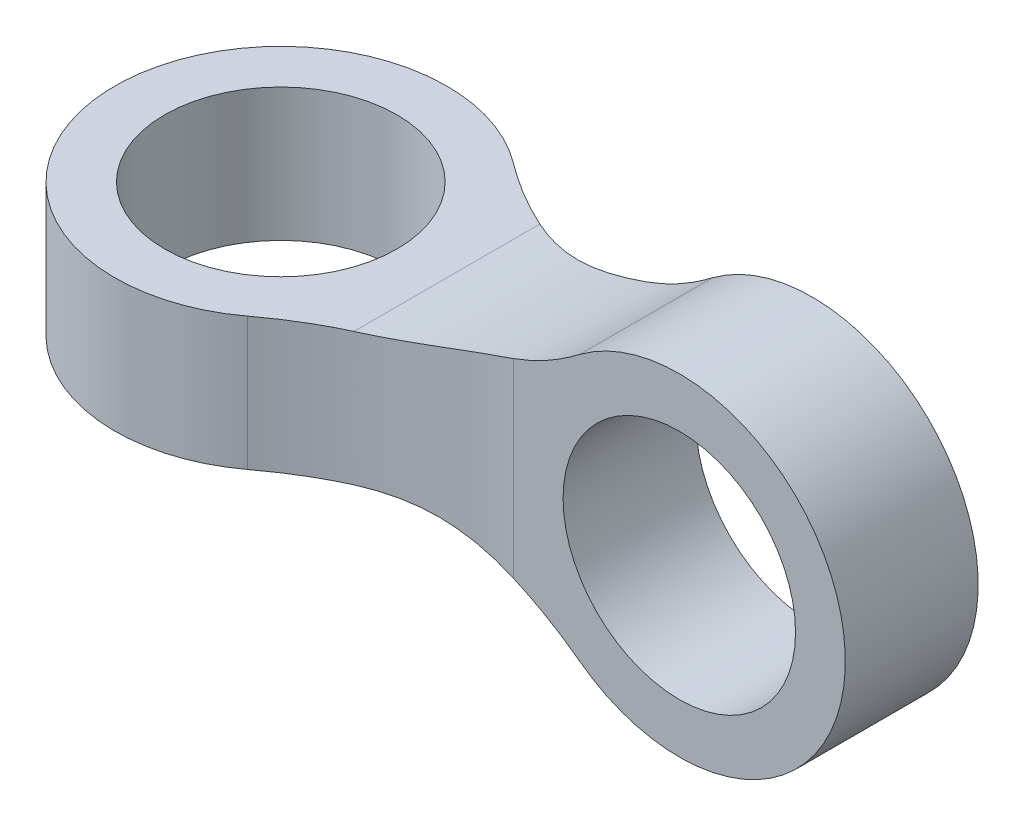
ISO-10303-21;
HEADER;
FILE_DESCRIPTION(('STEP AP214'),'2;1');
FILE_NAME('part.step','',(''),(''),'','','');
FILE_SCHEMA(('AUTOMOTIVE_DESIGN { 1 0 10303 214 1 1 1 1 }'));
ENDSEC;
DATA;
#1=APPLICATION_CONTEXT('core data for automotive mechanical design processes');
#2=APPLICATION_PROTOCOL_DEFINITION('international standard','automotive_design',2000,#1);
#3=PRODUCT_CONTEXT('',#1,'mechanical');
#4=PRODUCT('Part','Part','',(#3));
#5=PRODUCT_RELATED_PRODUCT_CATEGORY('part','',(#4));
#6=PRODUCT_DEFINITION_FORMATION('','',#4);
#7=PRODUCT_DEFINITION_CONTEXT('part definition',#1,'design');
#8=PRODUCT_DEFINITION('design','',#6,#7);
#9=PRODUCT_DEFINITION_SHAPE('','',#8);
#10=(LENGTH_UNIT() NAMED_UNIT(*) SI_UNIT(.MILLI.,.METRE.));
#11=(NAMED_UNIT(*) PLANE_ANGLE_UNIT() SI_UNIT($,.RADIAN.));
#12=(NAMED_UNIT(*) SI_UNIT($,.STERADIAN.) SOLID_ANGLE_UNIT());
#13=UNCERTAINTY_MEASURE_WITH_UNIT(LENGTH_MEASURE(1.E-05),#10,'distance_accuracy_value','');
#14=(GEOMETRIC_REPRESENTATION_CONTEXT(3) GLOBAL_UNCERTAINTY_ASSIGNED_CONTEXT((#13)) GLOBAL_UNIT_ASSIGNED_CONTEXT((#10,
#11,#12)) REPRESENTATION_CONTEXT('',''));
#15=CARTESIAN_POINT('',(0.,0.,0.));
#16=DIRECTION('',(0.,0.,1.));
#17=DIRECTION('',(1.,0.,0.));
#18=AXIS2_PLACEMENT_3D('',#15,#16,#17);
#19=CARTESIAN_POINT('',(90.,60.,-20.));
#20=CARTESIAN_POINT('',(73.7408291214227,60.,-19.9572997651025));
#21=CARTESIAN_POINT('',(53.5221056387912,60.,-22.3584207709066));
#22=CARTESIAN_POINT('',(30.,60.,-40.));
#23=B_SPLINE_CURVE_WITH_KNOTS('',3,(#19,#20,#21,#22),.UNSPECIFIED.,.F.,.F.,(4,4),(0.,0.5),.UNSPECIFIED.);
#24=DIRECTION('',(0.,-1.,0.));
#25=VECTOR('',#24,1.);
#26=SURFACE_OF_LINEAR_EXTRUSION('',#23,#25);
#27=CARTESIAN_POINT('',(90.,28.9330573132932,-20.));
#28=CARTESIAN_POINT('',(89.4810429815222,28.7428918932531,-19.9986251547515));
#29=CARTESIAN_POINT('',(88.9605668632478,28.5569066879373,-19.9997698882981));
#30=CARTESIAN_POINT('',(87.9172321575486,28.1917563344969,-20.0077030063632));
#31=CARTESIAN_POINT('',(87.3943734267869,28.0125916029197,-20.0144917350014));
#32=CARTESIAN_POINT('',(86.3469525640148,27.6595511206822,-20.0343184110861));
#33=CARTESIAN_POINT('',(85.822390304583,27.4856757762375,-20.0473568372163));
#34=CARTESIAN_POINT('',(84.7721816217902,27.1418155350938,-20.0802043244971));
#35=CARTESIAN_POINT('',(84.246535156449,26.9718307922413,-20.1000136528986));
#36=CARTESIAN_POINT('',(83.1947175666761,26.6345418159903,-20.1468657764545));
#37=CARTESIAN_POINT('',(82.6685464534944,26.4672375263736,-20.1739084196905));
#38=CARTESIAN_POINT('',(81.6232771448351,26.1364574357329,-20.235208612664));
#39=CARTESIAN_POINT('',(81.1041796481128,25.9729604693584,-20.2693635122836));
#40=CARTESIAN_POINT('',(80.0657928439244,25.6483852316269,-20.3454790499061));
#41=CARTESIAN_POINT('',(79.5465035350316,25.4873069786452,-20.3874397471787));
#42=CARTESIAN_POINT('',(78.5076136006931,25.168402627264,-20.4795256633909));
#43=CARTESIAN_POINT('',(77.9880129587846,25.0105767200303,-20.5296513607182));
#44=CARTESIAN_POINT('',(76.9484165504957,24.6988808245608,-20.6384036989028));
#45=CARTESIAN_POINT('',(76.4284207331901,24.5450114911255,-20.6970317363452));
#46=CARTESIAN_POINT('',(75.387972589171,24.2418666193231,-20.8231047436387));
#47=CARTESIAN_POINT('',(74.8675201690481,24.0925925889454,-20.8905525704688));
#48=CARTESIAN_POINT('',(73.6699468378422,23.7552331101707,-21.0561599123149));
#49=CARTESIAN_POINT('',(72.9927433760937,23.5689641000881,-21.1574577750833));
#50=CARTESIAN_POINT('',(71.6379800525443,23.206529733167,-21.3759709205634));
#51=CARTESIAN_POINT('',(70.9604201442885,23.0303673071811,-21.4931907877106));
#52=CARTESIAN_POINT('',(69.6054794852812,22.6894062868841,-21.7439635576232));
#53=CARTESIAN_POINT('',(68.9280987289844,22.5246072859862,-21.8775158755338));
#54=CARTESIAN_POINT('',(67.5740549423953,22.2075588403357,-22.1612718187178));
#55=CARTESIAN_POINT('',(66.8973917802267,22.0553064361532,-22.3114714975791));
#56=CARTESIAN_POINT('',(65.5453141091722,21.7644774750523,-22.6287462769199));
#57=CARTESIAN_POINT('',(64.8698992681802,21.625896526973,-22.7958159237851));
#58=CARTESIAN_POINT('',(63.5208417429445,21.3634923937548,-23.1469631741516));
#59=CARTESIAN_POINT('',(62.8471985873098,21.2396647880547,-23.331035653579));
#60=CARTESIAN_POINT('',(61.4883117690797,21.0054225212922,-23.7202103976134));
#61=CARTESIAN_POINT('',(60.803112788322,20.8953341633744,-23.9256659049603));
#62=CARTESIAN_POINT('',(59.4356169494068,20.6927113918557,-24.3543021336505));
#63=CARTESIAN_POINT('',(58.7533202609507,20.6001779912937,-24.5774838768628));
#64=CARTESIAN_POINT('',(57.3920789495322,20.4337308375673,-25.0414670426346));
#65=CARTESIAN_POINT('',(56.7131360829281,20.359825997219,-25.282276828482));
#66=CARTESIAN_POINT('',(55.3590267321822,20.2317001028583,-25.7813369809003));
#67=CARTESIAN_POINT('',(54.6838647450866,20.1774989675196,-26.0396046848861));
#68=CARTESIAN_POINT('',(53.3377134135381,20.089858381728,-26.5733456570009));
#69=CARTESIAN_POINT('',(52.6667327686443,20.0564532589357,-26.848846551289));
#70=CARTESIAN_POINT('',(51.3293199682823,20.0114939645753,-27.4167251311329));
#71=CARTESIAN_POINT('',(50.6629025277694,19.999992239821,-27.7091416013127));
#72=CARTESIAN_POINT('',(50.,20.,-28.0093822772648));
#73=B_SPLINE_CURVE_WITH_KNOTS('',3,(#27,#28,#29,#30,#31,#32,#33,#34,#35,#36,#37,#38,#39,#40,#41,
#42,#43,#44,#45,#46,#47,#48,#49,#50,#51,#52,#53,#54,#55,#56,#57,#58,#59,#60,#61,#62,#63,#64,#65,
#66,#67,#68,#69,#70,#71,#72),.UNSPECIFIED.,.F.,.F.,(4,2,2,2,2,2,2,2,2,2,2,2,2,2,2,2,2,2,2,2,2,2,
4),(0.,1.65806132145984,3.31622374391333,4.97451319047031,6.63286809809701,8.29118817870538,
9.92705408107455,11.56293240516,13.1989066099377,14.8351498430533,16.4719244206771,
18.6005429151099,20.7297756087387,22.8589320782104,24.9875848865225,27.1155517474839,
29.2428793911621,31.4137366047316,33.5847190532548,35.7567382429363,37.9309470826005,
40.108735405057,42.2917318302188),.UNSPECIFIED.);
#74=CARTESIAN_POINT('',(90.000000000002,28.9330573132939,-20.));
#75=VERTEX_POINT('',#74);
#76=CARTESIAN_POINT('',(50.,20.,-28.0093822785419));
#77=VERTEX_POINT('',#76);
#78=EDGE_CURVE('E195',#75,#77,#73,.T.);
#79=ORIENTED_EDGE('',*,*,#78,.F.);
#80=DIRECTION('',(0.,-1.,0.));
#81=VECTOR('',#80,1.);
#82=CARTESIAN_POINT('',(90.,60.,-20.));
#83=LINE('',#82,#81);
#84=CARTESIAN_POINT('',(90.0000000000004,-28.3100634071592,-20.));
#85=VERTEX_POINT('',#84);
#86=EDGE_CURVE('E121',#75,#85,#83,.T.);
#87=ORIENTED_EDGE('',*,*,#86,.T.);
#88=CARTESIAN_POINT('',(50.,-20.,-28.0093822772648));
#89=CARTESIAN_POINT('',(50.6178327846514,-20.0000027786416,-27.7295644457079));
#90=CARTESIAN_POINT('',(51.2387503042079,-20.0045451025787,-27.4565120022171));
#91=CARTESIAN_POINT('',(52.4869004229025,-20.0235257370117,-26.9241375081813));
#92=CARTESIAN_POINT('',(53.1141378367984,-20.0379722599034,-26.6648270446307));
#93=CARTESIAN_POINT('',(54.3743525334812,-20.0775905063413,-26.1604795744991));
#94=CARTESIAN_POINT('',(55.0073324584195,-20.1027674404389,-25.9154495681223));
#95=CARTESIAN_POINT('',(56.2784097289627,-20.1646695548739,-25.4401259930842));
#96=CARTESIAN_POINT('',(56.9165081954791,-20.20139733596,-25.2098357572462));
#97=CARTESIAN_POINT('',(58.1971758166748,-20.2871947621656,-24.7643775754228));
#98=CARTESIAN_POINT('',(58.8397451601954,-20.3362649317186,-24.5492102725147));
#99=CARTESIAN_POINT('',(60.1144019964432,-20.4462587853359,-24.1388934698888));
#100=CARTESIAN_POINT('',(60.7464052681065,-20.5068949555652,-23.943405482259));
#101=CARTESIAN_POINT('',(62.013319804045,-20.6412992075008,-23.5673917481709));
#102=CARTESIAN_POINT('',(62.6482304382998,-20.7150645642133,-23.3868629082792));
#103=CARTESIAN_POINT('',(63.9202631456837,-20.8762557100685,-23.040877259824));
#104=CARTESIAN_POINT('',(64.5573846751187,-20.963678345334,-22.8754169854044));
#105=CARTESIAN_POINT('',(65.8331349652304,-21.1525963440086,-22.5595826630009));
#106=CARTESIAN_POINT('',(66.4717633785798,-21.2540887267438,-22.4092054312757));
#107=CARTESIAN_POINT('',(67.7498130471559,-21.4714175237791,-22.1234548450162));
#108=CARTESIAN_POINT('',(68.3892341444461,-21.5872514299851,-21.9880788748356));
#109=CARTESIAN_POINT('',(69.7309319592545,-21.8454592866575,-21.719589127604));
#110=CARTESIAN_POINT('',(70.4332275354415,-21.9893216921285,-21.5879971925613));
#111=CARTESIAN_POINT('',(71.8372242999293,-22.2944448525586,-21.3422734701899));
#112=CARTESIAN_POINT('',(72.5389253562269,-22.4557087807122,-21.2281448765342));
#113=CARTESIAN_POINT('',(73.9409792906984,-22.7953283092227,-21.0168213139874));
#114=CARTESIAN_POINT('',(74.6413316478338,-22.9736895296863,-20.9196319430341));
#115=CARTESIAN_POINT('',(76.0399948702484,-23.3469505529435,-20.7415335479941));
#116=CARTESIAN_POINT('',(76.7383048295362,-23.5418567994725,-20.6606309087878));
#117=CARTESIAN_POINT('',(77.7836543233434,-23.8460005977632,-20.5509142024087));
#118=CARTESIAN_POINT('',(78.1318131057255,-23.9493653023636,-20.5162764014069));
#119=CARTESIAN_POINT('',(78.8273388459317,-24.1598855337923,-20.4507720591036));
#120=CARTESIAN_POINT('',(79.1747058030101,-24.2670410641889,-20.4199055213523));
#121=CARTESIAN_POINT('',(80.2329614195024,-24.5996334741349,-20.3313307801967));
#122=CARTESIAN_POINT('',(80.9424640149444,-24.8310941915198,-20.2794807858671));
#123=CARTESIAN_POINT('',(82.356950568301,-25.3096921200768,-20.1900774457083));
#124=CARTESIAN_POINT('',(83.0619350699912,-25.556827404184,-20.1525223463934));
#125=CARTESIAN_POINT('',(84.4664792996683,-26.0665496495789,-20.090491050161));
#126=CARTESIAN_POINT('',(85.1660415261347,-26.3291289483475,-20.0660084271226));
#127=CARTESIAN_POINT('',(86.5588262400372,-26.8694553104999,-20.0287782838828));
#128=CARTESIAN_POINT('',(87.2520540936018,-27.1471878064755,-20.0160196963349));
#129=CARTESIAN_POINT('',(88.6312957077748,-27.7174742356598,-20.0007315210437));
#130=CARTESIAN_POINT('',(89.3173186671545,-28.0100055023423,-19.9981867425644));
#131=CARTESIAN_POINT('',(90.,-28.310063407159,-20.));
#132=B_SPLINE_CURVE_WITH_KNOTS('',3,(#88,#89,#90,#91,#92,#93,#94,#95,#96,#97,#98,#99,#100,#101,
#102,#103,#104,#105,#106,#107,#108,#109,#110,#111,#112,#113,#114,#115,#116,#117,#118,#119,#120,
#121,#122,#123,#124,#125,#126,#127,#128,#129,#130,#131),.UNSPECIFIED.,.F.,.F.,(4,2,2,2,2,2,2,2,
2,2,2,2,2,2,2,2,2,2,2,2,2,4),(0.,2.03470510598334,4.07109939915323,6.10848366819714,
8.14632699644464,10.1842569282128,12.1769183742291,14.1691667199131,16.1609556736712,
18.1523233102406,20.1433431803018,22.329482739324,24.5160216200956,26.7032817261262,
28.8913976400945,29.9858436581929,31.0802907065577,33.3242413641173,35.5679166783207,
37.8104880368751,40.0509402541628,42.2880590668767),.UNSPECIFIED.);
#133=CARTESIAN_POINT('',(50.,-20.,-28.0093822785419));
#134=VERTEX_POINT('',#133);
#135=EDGE_CURVE('E311',#134,#85,#132,.T.);
#136=ORIENTED_EDGE('',*,*,#135,.F.);
#137=CARTESIAN_POINT('',(90.,-20.,-20.));
#138=CARTESIAN_POINT('',(73.7408291214227,-20.,-19.9572997651025));
#139=CARTESIAN_POINT('',(53.5221056387912,-20.,-22.3584207709066));
#140=CARTESIAN_POINT('',(30.,-20.,-40.));
#141=B_SPLINE_CURVE_WITH_KNOTS('',3,(#137,#138,#139,#140),.UNSPECIFIED.,.F.,.F.,(4,4),(0.,0.5),.UNSPECIFIED.);
#142=CARTESIAN_POINT('',(30.,-20.,-40.));
#143=VERTEX_POINT('',#142);
#144=EDGE_CURVE('E131',#143,#134,#141,.F.);
#145=ORIENTED_EDGE('',*,*,#144,.F.);
#146=DIRECTION('',(0.,-1.,0.));
#147=VECTOR('',#146,1.);
#148=CARTESIAN_POINT('',(30.,60.,-40.));
#149=LINE('',#148,#147);
#150=CARTESIAN_POINT('',(30.,20.,-40.));
#151=VERTEX_POINT('',#150);
#152=EDGE_CURVE('E238',#151,#143,#149,.T.);
#153=ORIENTED_EDGE('',*,*,#152,.F.);
#154=CARTESIAN_POINT('',(90.,20.,-20.));
#155=CARTESIAN_POINT('',(73.7408291214227,20.,-19.9572997651025));
#156=CARTESIAN_POINT('',(53.5221056387912,20.,-22.3584207709066));
#157=CARTESIAN_POINT('',(30.,20.,-40.));
#158=B_SPLINE_CURVE_WITH_KNOTS('',3,(#154,#155,#156,#157),.UNSPECIFIED.,.F.,.F.,(4,4),(0.,0.5),.UNSPECIFIED.);
#159=EDGE_CURVE('E178',#77,#151,#158,.T.);
#160=ORIENTED_EDGE('',*,*,#159,.F.);
#161=EDGE_LOOP('',(#79,#87,#136,#145,#153,#160));
#162=FACE_BOUND('',#161,.T.);
#163=ADVANCED_FACE('F46',(#162),#26,.F.);
#164=CARTESIAN_POINT('',(0.,60.,0.));
#165=DIRECTION('',(0.,-1.,0.));
#166=DIRECTION('',(0.,0.,-1.));
#167=AXIS2_PLACEMENT_3D('',#164,#165,#166);
#168=CYLINDRICAL_SURFACE('',#167,50.);
#169=DIRECTION('',(0.,-1.,0.));
#170=VECTOR('',#169,1.);
#171=CARTESIAN_POINT('',(30.,60.,40.));
#172=LINE('',#171,#170);
#173=CARTESIAN_POINT('',(30.,20.,40.));
#174=VERTEX_POINT('',#173);
#175=CARTESIAN_POINT('',(30.,-20.,40.));
#176=VERTEX_POINT('',#175);
#177=EDGE_CURVE('E143',#174,#176,#172,.T.);
#178=ORIENTED_EDGE('',*,*,#177,.F.);
#179=CARTESIAN_POINT('',(0.,20.,0.));
#180=DIRECTION('',(0.,1.,0.));
#181=DIRECTION('',(0.,0.,1.));
#182=AXIS2_PLACEMENT_3D('',#179,#180,#181);
#183=CIRCLE('',#182,50.);
#184=EDGE_CURVE('E173',#151,#174,#183,.T.);
#185=ORIENTED_EDGE('',*,*,#184,.F.);
#186=ORIENTED_EDGE('',*,*,#152,.T.);
#187=CARTESIAN_POINT('',(0.,-20.,0.));
#188=DIRECTION('',(0.,-1.,0.));
#189=DIRECTION('',(0.,0.,-1.));
#190=AXIS2_PLACEMENT_3D('',#187,#188,#189);
#191=CIRCLE('',#190,50.);
#192=EDGE_CURVE('E141',#176,#143,#191,.T.);
#193=ORIENTED_EDGE('',*,*,#192,.F.);
#194=EDGE_LOOP('',(#178,#185,#186,#193));
#195=FACE_BOUND('',#194,.T.);
#196=ADVANCED_FACE('F291',(#195),#168,.T.);
#197=CARTESIAN_POINT('',(30.,60.,40.));
#198=CARTESIAN_POINT('',(53.5221056387912,60.,22.3584207709066));
#199=CARTESIAN_POINT('',(73.7408291214227,60.,19.9572997651025));
#200=CARTESIAN_POINT('',(90.,60.,20.));
#201=B_SPLINE_CURVE_WITH_KNOTS('',3,(#197,#198,#199,#200),.UNSPECIFIED.,.F.,.F.,(4,4),(0.,0.5),.UNSPECIFIED.);
#202=DIRECTION('',(0.,-1.,0.));
#203=VECTOR('',#202,1.);
#204=SURFACE_OF_LINEAR_EXTRUSION('',#201,#203);
#205=CARTESIAN_POINT('',(50.,20.,28.0093822772648));
#206=CARTESIAN_POINT('',(50.5092275003379,19.9999972102997,27.7787528188228));
#207=CARTESIAN_POINT('',(51.0205312403253,20.0067826129404,27.5527293291898));
#208=CARTESIAN_POINT('',(52.046627418762,20.0334708156726,27.11031424406));
#209=CARTESIAN_POINT('',(52.561417852946,20.0533666237817,26.8939175800606));
#210=CARTESIAN_POINT('',(53.5942046631586,20.1058093609873,26.470996218326));
#211=CARTESIAN_POINT('',(54.1121999793452,20.1383523069868,26.2644684354533));
#212=CARTESIAN_POINT('',(55.1511046009287,20.2156154001728,25.8614846448715));
#213=CARTESIAN_POINT('',(55.6720134866316,20.2603338356081,25.6650272259806));
#214=CARTESIAN_POINT('',(56.7164417687004,20.3614694456683,25.2823571696094));
#215=CARTESIAN_POINT('',(57.2399611326865,20.4178864755366,25.0961444053993));
#216=CARTESIAN_POINT('',(58.2812064893458,20.5409763475201,24.7368948944764));
#217=CARTESIAN_POINT('',(58.7988980868362,20.6074785042158,24.5636997932315));
#218=CARTESIAN_POINT('',(59.8361820109667,20.7508761491949,24.2274839633047));
#219=CARTESIAN_POINT('',(60.3557744731813,20.8277723934487,24.0644639759292));
#220=CARTESIAN_POINT('',(61.3965354245764,20.9914717266841,23.748667972368));
#221=CARTESIAN_POINT('',(61.9177039921271,21.0782753164548,23.5958924746335));
#222=CARTESIAN_POINT('',(62.961285956914,21.2612900798744,23.3006194698885));
#223=CARTESIAN_POINT('',(63.4836993301022,21.3575010732,23.1581217659619));
#224=CARTESIAN_POINT('',(64.5294265273624,21.5588149406792,22.883402775169));
#225=CARTESIAN_POINT('',(65.0527402153476,21.6639165699219,22.7511800545071));
#226=CARTESIAN_POINT('',(66.2469499119454,21.9131679410864,22.4612807288248));
#227=CARTESIAN_POINT('',(66.9180796625704,22.0600028044755,22.3068638369388));
#228=CARTESIAN_POINT('',(68.2610501977576,22.3663522042267,22.0145361195379));
#229=CARTESIAN_POINT('',(68.9328910066003,22.52586718833,21.8766258773118));
#230=CARTESIAN_POINT('',(70.2770532126029,22.8565071377557,21.6169674125063));
#231=CARTESIAN_POINT('',(70.9493746935467,23.0276355826705,21.4952240663997));
#232=CARTESIAN_POINT('',(72.294259924268,23.3803851398115,21.2674951342541));
#233=CARTESIAN_POINT('',(72.9668236448151,23.5620109984643,21.1615167550065));
#234=CARTESIAN_POINT('',(74.3119651739733,23.9345675133111,20.9648453354276));
#235=CARTESIAN_POINT('',(74.9845428247881,24.1255027305276,20.8741598867171));
#236=CARTESIAN_POINT('',(76.3294969604491,24.515379830314,20.7075303091209));
#237=CARTESIAN_POINT('',(77.0018732478181,24.7143249836936,20.6315922774965));
#238=CARTESIAN_POINT('',(78.362541201753,25.1236806477682,20.4921674706112));
#239=CARTESIAN_POINT('',(79.0508200735596,25.3342525542409,20.4290305031251));
#240=CARTESIAN_POINT('',(80.0828783631043,25.6539090330626,20.3448646964459));
#241=CARTESIAN_POINT('',(80.4268290562072,25.7610915245662,20.3185665692293));
#242=CARTESIAN_POINT('',(81.1146528404651,25.9764868888041,20.2693755887831));
#243=CARTESIAN_POINT('',(81.4585259315506,26.0846997624596,20.2464827385981));
#244=CARTESIAN_POINT('',(82.1460957952753,26.3017725750519,20.2040015825166));
#245=CARTESIAN_POINT('',(82.4897925758944,26.4106321915165,20.1844117529141));
#246=CARTESIAN_POINT('',(83.1770780828212,26.6292111248045,20.1484152615314));
#247=CARTESIAN_POINT('',(83.5206668092226,26.7389304408794,20.1320085969802));
#248=CARTESIAN_POINT('',(84.5503964238251,27.0696499687171,20.0874216289176));
#249=CARTESIAN_POINT('',(85.2361730399108,27.2924227462021,20.063833289466));
#250=CARTESIAN_POINT('',(86.6045191904788,27.7451685874819,20.0278833948094));
#251=CARTESIAN_POINT('',(87.2870919743187,27.9751304734079,20.0155052281075));
#252=CARTESIAN_POINT('',(88.307571567548,28.3279406545509,20.0043865688883));
#253=CARTESIAN_POINT('',(88.646842649038,28.4467369457747,20.0019205814149));
#254=CARTESIAN_POINT('',(89.3242915446941,28.6874497789306,19.9992832813468));
#255=CARTESIAN_POINT('',(89.6624693385069,28.8093663785794,19.9991120112285));
#256=CARTESIAN_POINT('',(90.,28.9330573132932,20.));
#257=B_SPLINE_CURVE_WITH_KNOTS('',3,(#205,#206,#207,#208,#209,#210,#211,#212,#213,#214,#215,
#216,#217,#218,#219,#220,#221,#222,#223,#224,#225,#226,#227,#228,#229,#230,#231,#232,#233,#234,
#235,#236,#237,#238,#239,#240,#241,#242,#243,#244,#245,#246,#247,#248,#249,#250,#251,#252,#253,
#254,#255,#256),.UNSPECIFIED.,.F.,.F.,(4,2,2,2,2,2,2,2,2,2,2,2,2,2,2,2,2,2,2,2,2,2,2,2,2,4),(0.,
1.67698090806173,3.35306817927683,5.02862800979671,6.70395239499962,8.37925605122723,
10.0288486066308,11.6785612028839,13.3283572245562,14.9781216287562,16.6276554059586,
18.7397551021646,20.8519294107708,22.9647393811489,25.0785122520425,27.1933313595796,
29.3090229779218,31.4764404568977,32.560094135934,33.6437487837899,34.7269021584746,
35.8100545902615,37.974242322325,40.1352178378682,41.2136278766659,42.2920578773578),.UNSPECIFIED.);
#258=CARTESIAN_POINT('',(50.,20.,28.0093822785419));
#259=VERTEX_POINT('',#258);
#260=CARTESIAN_POINT('',(90.000000000002,28.9330573132939,20.));
#261=VERTEX_POINT('',#260);
#262=EDGE_CURVE('E267',#259,#261,#257,.T.);
#263=ORIENTED_EDGE('',*,*,#262,.F.);
#264=CARTESIAN_POINT('',(30.,20.,40.));
#265=CARTESIAN_POINT('',(53.5221056387912,20.,22.3584207709066));
#266=CARTESIAN_POINT('',(73.7408291214227,20.,19.9572997651025));
#267=CARTESIAN_POINT('',(90.,20.,20.));
#268=B_SPLINE_CURVE_WITH_KNOTS('',3,(#264,#265,#266,#267),.UNSPECIFIED.,.F.,.F.,(4,4),(0.,0.5),.UNSPECIFIED.);
#269=EDGE_CURVE('E167',#174,#259,#268,.T.);
#270=ORIENTED_EDGE('',*,*,#269,.F.);
#271=ORIENTED_EDGE('',*,*,#177,.T.);
#272=CARTESIAN_POINT('',(30.,-20.,40.));
#273=CARTESIAN_POINT('',(53.5221056387912,-20.,22.3584207709066));
#274=CARTESIAN_POINT('',(73.7408291214227,-20.,19.9572997651025));
#275=CARTESIAN_POINT('',(90.,-20.,20.));
#276=B_SPLINE_CURVE_WITH_KNOTS('',3,(#272,#273,#274,#275),.UNSPECIFIED.,.F.,.F.,(4,4),(0.,0.5),.UNSPECIFIED.);
#277=CARTESIAN_POINT('',(50.,-20.,28.0093822785419));
#278=VERTEX_POINT('',#277);
#279=EDGE_CURVE('E129',#278,#176,#276,.F.);
#280=ORIENTED_EDGE('',*,*,#279,.F.);
#281=CARTESIAN_POINT('',(90.,-28.310063407159,20.));
#282=CARTESIAN_POINT('',(89.3779913971768,-28.0366741763348,19.9983524145366));
#283=CARTESIAN_POINT('',(88.7532117646014,-27.7695328481926,20.0003169969112));
#284=CARTESIAN_POINT('',(87.4977729914959,-27.2475581248982,20.0126000892625));
#285=CARTESIAN_POINT('',(86.8671079157217,-26.992739237399,20.0229282038101));
#286=CARTESIAN_POINT('',(85.600526935532,-26.4956678703741,20.0530880241291));
#287=CARTESIAN_POINT('',(84.9646075057747,-26.2534247848271,20.0729267241312));
#288=CARTESIAN_POINT('',(83.6881722265764,-25.7817203321437,20.1231479957155));
#289=CARTESIAN_POINT('',(83.0476546804563,-25.5522639892491,20.1535346784407));
#290=CARTESIAN_POINT('',(81.7626848010728,-25.1063129060965,20.2258057047466));
#291=CARTESIAN_POINT('',(81.1182320533566,-24.8898195579744,20.2676912805406));
#292=CARTESIAN_POINT('',(79.8404581926321,-24.4745903787087,20.36274570607));
#293=CARTESIAN_POINT('',(79.2072106905527,-24.2755655893378,20.4156410917029));
#294=CARTESIAN_POINT('',(77.9381954308307,-23.8901584075686,20.5339543231659));
#295=CARTESIAN_POINT('',(77.3024282805433,-23.7037731438619,20.599369311937));
#296=CARTESIAN_POINT('',(76.0287951226056,-23.3443793789366,20.7433703418315));
#297=CARTESIAN_POINT('',(75.3909297539332,-23.1713671389796,20.8219526821124));
#298=CARTESIAN_POINT('',(74.1135757009516,-22.8392478174853,20.9928554199286));
#299=CARTESIAN_POINT('',(73.474087428599,-22.6801375119542,21.0851726187224));
#300=CARTESIAN_POINT('',(72.1939970733046,-22.3761970179613,21.2840268502863));
#301=CARTESIAN_POINT('',(71.5533951107924,-22.2313653726622,21.3905624297533));
#302=CARTESIAN_POINT('',(70.211885877139,-21.9433595183876,21.6288604564297));
#303=CARTESIAN_POINT('',(69.5109270087867,-21.8015999742157,21.7620490560446));
#304=CARTESIAN_POINT('',(68.1091647476998,-21.5354347169287,22.0462687038934));
#305=CARTESIAN_POINT('',(67.4083614241947,-21.4110328696155,22.1973037129835));
#306=CARTESIAN_POINT('',(66.0078566564352,-21.1794011226079,22.5174328651162));
#307=CARTESIAN_POINT('',(65.3081555260593,-21.0721754595809,22.6865314466168));
#308=CARTESIAN_POINT('',(63.9108044979286,-20.874490271864,23.0428609480051));
#309=CARTESIAN_POINT('',(63.2131552025753,-20.7840352649463,23.230096733172));
#310=CARTESIAN_POINT('',(61.8208515344237,-20.6192938932379,23.6226326006197));
#311=CARTESIAN_POINT('',(61.1261979562717,-20.545011587473,23.8279371996991));
#312=CARTESIAN_POINT('',(59.7238676299622,-20.4102355044645,24.2616486650005));
#313=CARTESIAN_POINT('',(59.016291466936,-20.3501263544006,24.4904999599746));
#314=CARTESIAN_POINT('',(57.6062398295109,-20.2451541571723,24.9665859839929));
#315=CARTESIAN_POINT('',(56.9037642324234,-20.200290742091,25.213820269235));
#316=CARTESIAN_POINT('',(55.5047834783381,-20.124781648917,25.7262037954292));
#317=CARTESIAN_POINT('',(54.808277088667,-20.0941329624048,25.9913492320257));
#318=CARTESIAN_POINT('',(53.4220711570889,-20.0459756868811,26.5389751945402));
#319=CARTESIAN_POINT('',(52.7323683810295,-20.0284605250661,26.8214469726417));
#320=CARTESIAN_POINT('',(51.3605393767901,-20.0054799369396,27.4030301963863));
#321=CARTESIAN_POINT('',(50.6784068900888,-20.0000036833021,27.7021264421616));
#322=CARTESIAN_POINT('',(50.,-20.,28.0093822772648));
#323=B_SPLINE_CURVE_WITH_KNOTS('',3,(#281,#282,#283,#284,#285,#286,#287,#288,#289,#290,#291,
#292,#293,#294,#295,#296,#297,#298,#299,#300,#301,#302,#303,#304,#305,#306,#307,#308,#309,#310,
#311,#312,#313,#314,#315,#316,#317,#318,#319,#320,#321,#322),.UNSPECIFIED.,.F.,.F.,(4,2,2,2,2,2,
2,2,2,2,2,2,2,2,2,2,2,2,2,2,4),(0.,2.03829801153542,4.07894010294795,6.12108522142612,
8.16402717424621,10.207188132811,12.2046285159035,14.2016136118033,16.1980383696001,
18.1939989013248,20.189755576006,22.3716664154713,24.5540624239951,26.7369959148786,
28.9205166047546,31.1045846847073,33.3424405199229,35.5802423463699,37.8175703458126,
40.0537779034472,42.2879734787482),.UNSPECIFIED.);
#324=CARTESIAN_POINT('',(90.0000000000004,-28.3100634071592,20.));
#325=VERTEX_POINT('',#324);
#326=EDGE_CURVE('E111',#325,#278,#323,.T.);
#327=ORIENTED_EDGE('',*,*,#326,.F.);
#328=DIRECTION('',(0.,-1.,0.));
#329=VECTOR('',#328,1.);
#330=CARTESIAN_POINT('',(90.,60.,20.));
#331=LINE('',#330,#329);
#332=EDGE_CURVE('E250',#261,#325,#331,.T.);
#333=ORIENTED_EDGE('',*,*,#332,.F.);
#334=EDGE_LOOP('',(#263,#270,#271,#280,#327,#333));
#335=FACE_BOUND('',#334,.T.);
#336=ADVANCED_FACE('F140',(#335),#204,.F.);
#337=CARTESIAN_POINT('',(190.,60.,20.));
#338=DIRECTION('',(0.,0.,-1.));
#339=DIRECTION('',(-1.,0.,0.));
#340=AXIS2_PLACEMENT_3D('',#337,#338,#339);
#341=PLANE('',#340);
#342=CARTESIAN_POINT('',(140.,0.,20.));
#343=DIRECTION('',(0.,0.,-1.));
#344=DIRECTION('',(-1.,0.,0.));
#345=AXIS2_PLACEMENT_3D('',#342,#343,#344);
#346=CIRCLE('',#345,35.);
#347=CARTESIAN_POINT('',(105.,0.,20.));
#348=VERTEX_POINT('',#347);
#349=EDGE_CURVE('E189',#348,#348,#346,.T.);
#350=ORIENTED_EDGE('',*,*,#349,.T.);
#351=EDGE_LOOP('',(#350));
#352=FACE_BOUND('',#351,.T.);
#353=CARTESIAN_POINT('',(110.,-40.,20.));
#354=CARTESIAN_POINT('',(100.09336452798,-32.5700233959847,20.));
#355=CARTESIAN_POINT('',(80.6591615163238,-23.1393181231754,20.));
#356=CARTESIAN_POINT('',(60.9320969884539,-20.,20.));
#357=CARTESIAN_POINT('',(50.,-20.,20.));
#358=B_SPLINE_CURVE_WITH_KNOTS('',3,(#353,#354,#355,#356,#357),.UNSPECIFIED.,.F.,.F.,(4,1,4),
(0.,0.546701071000049,1.),.UNSPECIFIED.);
#359=CARTESIAN_POINT('',(110.,-40.,20.));
#360=VERTEX_POINT('',#359);
#361=EDGE_CURVE('E71',#360,#325,#358,.T.);
#362=ORIENTED_EDGE('',*,*,#361,.F.);
#363=CARTESIAN_POINT('',(140.,0.,20.));
#364=DIRECTION('',(0.,0.,-1.));
#365=DIRECTION('',(-1.,0.,0.));
#366=AXIS2_PLACEMENT_3D('',#363,#364,#365);
#367=CIRCLE('',#366,50.);
#368=CARTESIAN_POINT('',(110.,40.,20.));
#369=VERTEX_POINT('',#368);
#370=EDGE_CURVE('E275',#369,#360,#367,.T.);
#371=ORIENTED_EDGE('',*,*,#370,.F.);
#372=CARTESIAN_POINT('',(50.,20.,20.));
#373=CARTESIAN_POINT('',(61.5064655590237,20.,20.));
#374=CARTESIAN_POINT('',(87.3895600290196,27.6859735170117,20.));
#375=CARTESIAN_POINT('',(99.4967245817717,32.1225434363288,20.));
#376=CARTESIAN_POINT('',(110.,40.,20.));
#377=B_SPLINE_CURVE_WITH_KNOTS('',3,(#372,#373,#374,#375,#376),.UNSPECIFIED.,.F.,.F.,(4,1,4),
(0.,0.450571266270669,1.),.UNSPECIFIED.);
#378=EDGE_CURVE('E203',#261,#369,#377,.T.);
#379=ORIENTED_EDGE('',*,*,#378,.F.);
#380=ORIENTED_EDGE('',*,*,#332,.T.);
#381=EDGE_LOOP('',(#362,#371,#379,#380));
#382=FACE_BOUND('',#381,.T.);
#383=ADVANCED_FACE('F273',(#352,#382),#341,.F.);
#384=CARTESIAN_POINT('',(90.,60.,-20.));
#385=DIRECTION('',(0.,0.,1.));
#386=DIRECTION('',(1.,0.,0.));
#387=AXIS2_PLACEMENT_3D('',#384,#385,#386);
#388=PLANE('',#387);
#389=CARTESIAN_POINT('',(140.,0.,-20.));
#390=DIRECTION('',(0.,0.,1.));
#391=DIRECTION('',(1.,0.,0.));
#392=AXIS2_PLACEMENT_3D('',#389,#390,#391);
#393=CIRCLE('',#392,35.);
#394=CARTESIAN_POINT('',(175.,0.,-20.));
#395=VERTEX_POINT('',#394);
#396=EDGE_CURVE('E183',#395,#395,#393,.T.);
#397=ORIENTED_EDGE('',*,*,#396,.T.);
#398=EDGE_LOOP('',(#397));
#399=FACE_BOUND('',#398,.T.);
#400=CARTESIAN_POINT('',(110.,-40.,-20.));
#401=CARTESIAN_POINT('',(100.09336452798,-32.5700233959847,-20.));
#402=CARTESIAN_POINT('',(80.6591615163238,-23.1393181231754,-20.));
#403=CARTESIAN_POINT('',(60.9320969884539,-20.,-20.));
#404=CARTESIAN_POINT('',(50.,-20.,-20.));
#405=B_SPLINE_CURVE_WITH_KNOTS('',3,(#400,#401,#402,#403,#404),.UNSPECIFIED.,.F.,.F.,(4,1,4),
(0.,0.546701071000049,1.),.UNSPECIFIED.);
#406=CARTESIAN_POINT('',(110.,-40.,-20.));
#407=VERTEX_POINT('',#406);
#408=EDGE_CURVE('E12',#85,#407,#405,.F.);
#409=ORIENTED_EDGE('',*,*,#408,.F.);
#410=ORIENTED_EDGE('',*,*,#86,.F.);
#411=CARTESIAN_POINT('',(50.,20.,-20.));
#412=CARTESIAN_POINT('',(61.5064655590237,20.,-20.));
#413=CARTESIAN_POINT('',(87.3895600290196,27.6859735170117,-20.));
#414=CARTESIAN_POINT('',(99.4967245817717,32.1225434363288,-20.));
#415=CARTESIAN_POINT('',(110.,40.,-20.));
#416=B_SPLINE_CURVE_WITH_KNOTS('',3,(#411,#412,#413,#414,#415),.UNSPECIFIED.,.F.,.F.,(4,1,4),
(0.,0.450571266270669,1.),.UNSPECIFIED.);
#417=CARTESIAN_POINT('',(110.,40.,-20.));
#418=VERTEX_POINT('',#417);
#419=EDGE_CURVE('E245',#418,#75,#416,.F.);
#420=ORIENTED_EDGE('',*,*,#419,.F.);
#421=CARTESIAN_POINT('',(140.,0.,-20.));
#422=DIRECTION('',(0.,0.,1.));
#423=DIRECTION('',(1.,0.,0.));
#424=AXIS2_PLACEMENT_3D('',#421,#422,#423);
#425=CIRCLE('',#424,50.);
#426=EDGE_CURVE('E59',#407,#418,#425,.T.);
#427=ORIENTED_EDGE('',*,*,#426,.F.);
#428=EDGE_LOOP('',(#409,#410,#420,#427));
#429=FACE_BOUND('',#428,.T.);
#430=ADVANCED_FACE('F268',(#399,#429),#388,.F.);
#431=CARTESIAN_POINT('',(110.,-40.,50.));
#432=CARTESIAN_POINT('',(100.09336452798,-32.5700233959847,50.));
#433=CARTESIAN_POINT('',(80.6591615163238,-23.1393181231754,50.));
#434=CARTESIAN_POINT('',(60.9320969884539,-20.,50.));
#435=CARTESIAN_POINT('',(50.,-20.,50.));
#436=B_SPLINE_CURVE_WITH_KNOTS('',3,(#431,#432,#433,#434,#435),.UNSPECIFIED.,.F.,.F.,(4,1,4),
(0.,0.546701071000049,1.),.UNSPECIFIED.);
#437=DIRECTION('',(0.,0.,-1.));
#438=VECTOR('',#437,1.);
#439=SURFACE_OF_LINEAR_EXTRUSION('',#436,#438);
#440=ORIENTED_EDGE('',*,*,#326,.T.);
#441=DIRECTION('',(0.,0.,-1.));
#442=VECTOR('',#441,1.);
#443=CARTESIAN_POINT('',(50.,-20.,50.));
#444=LINE('',#443,#442);
#445=EDGE_CURVE('E116',#278,#134,#444,.T.);
#446=ORIENTED_EDGE('',*,*,#445,.T.);
#447=ORIENTED_EDGE('',*,*,#135,.T.);
#448=ORIENTED_EDGE('',*,*,#408,.T.);
#449=DIRECTION('',(0.,0.,-1.));
#450=VECTOR('',#449,1.);
#451=CARTESIAN_POINT('',(110.,-40.,50.));
#452=LINE('',#451,#450);
#453=EDGE_CURVE('E218',#360,#407,#452,.T.);
#454=ORIENTED_EDGE('',*,*,#453,.F.);
#455=ORIENTED_EDGE('',*,*,#361,.T.);
#456=EDGE_LOOP('',(#440,#446,#447,#448,#454,#455));
#457=FACE_BOUND('',#456,.T.);
#458=ADVANCED_FACE('F119',(#457),#439,.T.);
#459=CARTESIAN_POINT('',(140.,0.,50.));
#460=DIRECTION('',(0.,0.,-1.));
#461=DIRECTION('',(-1.,0.,0.));
#462=AXIS2_PLACEMENT_3D('',#459,#460,#461);
#463=CYLINDRICAL_SURFACE('',#462,50.);
#464=ORIENTED_EDGE('',*,*,#370,.T.);
#465=ORIENTED_EDGE('',*,*,#453,.T.);
#466=ORIENTED_EDGE('',*,*,#426,.T.);
#467=DIRECTION('',(0.,0.,-1.));
#468=VECTOR('',#467,1.);
#469=CARTESIAN_POINT('',(110.,40.,50.));
#470=LINE('',#469,#468);
#471=EDGE_CURVE('E62',#369,#418,#470,.T.);
#472=ORIENTED_EDGE('',*,*,#471,.F.);
#473=EDGE_LOOP('',(#464,#465,#466,#472));
#474=FACE_BOUND('',#473,.T.);
#475=ADVANCED_FACE('F211',(#474),#463,.T.);
#476=CARTESIAN_POINT('',(50.,20.,50.));
#477=CARTESIAN_POINT('',(61.5064655590237,20.,50.));
#478=CARTESIAN_POINT('',(87.3895600290196,27.6859735170117,50.));
#479=CARTESIAN_POINT('',(99.4967245817717,32.1225434363288,50.));
#480=CARTESIAN_POINT('',(110.,40.,50.));
#481=B_SPLINE_CURVE_WITH_KNOTS('',3,(#476,#477,#478,#479,#480),.UNSPECIFIED.,.F.,.F.,(4,1,4),
(0.,0.450571266270669,1.),.UNSPECIFIED.);
#482=DIRECTION('',(0.,0.,-1.));
#483=VECTOR('',#482,1.);
#484=SURFACE_OF_LINEAR_EXTRUSION('',#481,#483);
#485=ORIENTED_EDGE('',*,*,#262,.T.);
#486=ORIENTED_EDGE('',*,*,#378,.T.);
#487=ORIENTED_EDGE('',*,*,#471,.T.);
#488=ORIENTED_EDGE('',*,*,#419,.T.);
#489=ORIENTED_EDGE('',*,*,#78,.T.);
#490=DIRECTION('',(0.,0.,-1.));
#491=VECTOR('',#490,1.);
#492=CARTESIAN_POINT('',(50.,20.,50.));
#493=LINE('',#492,#491);
#494=EDGE_CURVE('E132',#259,#77,#493,.T.);
#495=ORIENTED_EDGE('',*,*,#494,.F.);
#496=EDGE_LOOP('',(#485,#486,#487,#488,#489,#495));
#497=FACE_BOUND('',#496,.T.);
#498=ADVANCED_FACE('F202',(#497),#484,.T.);
#499=CARTESIAN_POINT('',(-50.,20.,50.));
#500=DIRECTION('',(0.,1.,0.));
#501=DIRECTION('',(0.,0.,1.));
#502=AXIS2_PLACEMENT_3D('',#499,#500,#501);
#503=PLANE('',#502);
#504=CARTESIAN_POINT('',(0.,20.,0.));
#505=DIRECTION('',(0.,1.,0.));
#506=DIRECTION('',(0.,0.,1.));
#507=AXIS2_PLACEMENT_3D('',#504,#505,#506);
#508=CIRCLE('',#507,35.);
#509=CARTESIAN_POINT('',(0.,20.,35.));
#510=VERTEX_POINT('',#509);
#511=EDGE_CURVE('E164',#510,#510,#508,.T.);
#512=ORIENTED_EDGE('',*,*,#511,.F.);
#513=EDGE_LOOP('',(#512));
#514=FACE_BOUND('',#513,.T.);
#515=ORIENTED_EDGE('',*,*,#159,.T.);
#516=ORIENTED_EDGE('',*,*,#184,.T.);
#517=ORIENTED_EDGE('',*,*,#269,.T.);
#518=ORIENTED_EDGE('',*,*,#494,.T.);
#519=EDGE_LOOP('',(#515,#516,#517,#518));
#520=FACE_BOUND('',#519,.T.);
#521=ADVANCED_FACE('F209',(#514,#520),#503,.T.);
#522=CARTESIAN_POINT('',(50.,-20.,50.));
#523=DIRECTION('',(0.,-1.,0.));
#524=DIRECTION('',(0.,0.,-1.));
#525=AXIS2_PLACEMENT_3D('',#522,#523,#524);
#526=PLANE('',#525);
#527=CARTESIAN_POINT('',(0.,-20.,0.));
#528=DIRECTION('',(0.,-1.,0.));
#529=DIRECTION('',(0.,0.,-1.));
#530=AXIS2_PLACEMENT_3D('',#527,#528,#529);
#531=CIRCLE('',#530,35.);
#532=CARTESIAN_POINT('',(0.,-20.,-35.));
#533=VERTEX_POINT('',#532);
#534=EDGE_CURVE('E133',#533,#533,#531,.T.);
#535=ORIENTED_EDGE('',*,*,#534,.F.);
#536=EDGE_LOOP('',(#535));
#537=FACE_BOUND('',#536,.T.);
#538=ORIENTED_EDGE('',*,*,#144,.T.);
#539=ORIENTED_EDGE('',*,*,#445,.F.);
#540=ORIENTED_EDGE('',*,*,#279,.T.);
#541=ORIENTED_EDGE('',*,*,#192,.T.);
#542=EDGE_LOOP('',(#538,#539,#540,#541));
#543=FACE_BOUND('',#542,.T.);
#544=ADVANCED_FACE('F126',(#537,#543),#526,.T.);
#545=CARTESIAN_POINT('',(140.,0.,50.));
#546=DIRECTION('',(0.,0.,-1.));
#547=DIRECTION('',(-1.,0.,0.));
#548=AXIS2_PLACEMENT_3D('',#545,#546,#547);
#549=CYLINDRICAL_SURFACE('',#548,35.);
#550=ORIENTED_EDGE('',*,*,#396,.F.);
#551=EDGE_LOOP('',(#550));
#552=FACE_BOUND('',#551,.T.);
#553=ORIENTED_EDGE('',*,*,#349,.F.);
#554=EDGE_LOOP('',(#553));
#555=FACE_BOUND('',#554,.T.);
#556=ADVANCED_FACE('F325',(#552,#555),#549,.F.);
#557=CARTESIAN_POINT('',(0.,60.,0.));
#558=DIRECTION('',(0.,-1.,0.));
#559=DIRECTION('',(0.,0.,-1.));
#560=AXIS2_PLACEMENT_3D('',#557,#558,#559);
#561=CYLINDRICAL_SURFACE('',#560,35.);
#562=ORIENTED_EDGE('',*,*,#534,.T.);
#563=EDGE_LOOP('',(#562));
#564=FACE_BOUND('',#563,.T.);
#565=ORIENTED_EDGE('',*,*,#511,.T.);
#566=EDGE_LOOP('',(#565));
#567=FACE_BOUND('',#566,.T.);
#568=ADVANCED_FACE('F327',(#564,#567),#561,.F.);
#569=CLOSED_SHELL('',(#163,#196,#336,#383,#430,#458,#475,#498,#521,#544,#556,#568));
#570=MANIFOLD_SOLID_BREP('B2',#569);
#571=ADVANCED_BREP_SHAPE_REPRESENTATION('',(#18,#570),#14);
#572=SHAPE_DEFINITION_REPRESENTATION(#9,#571);
ENDSEC;
END-ISO-10303-21;
